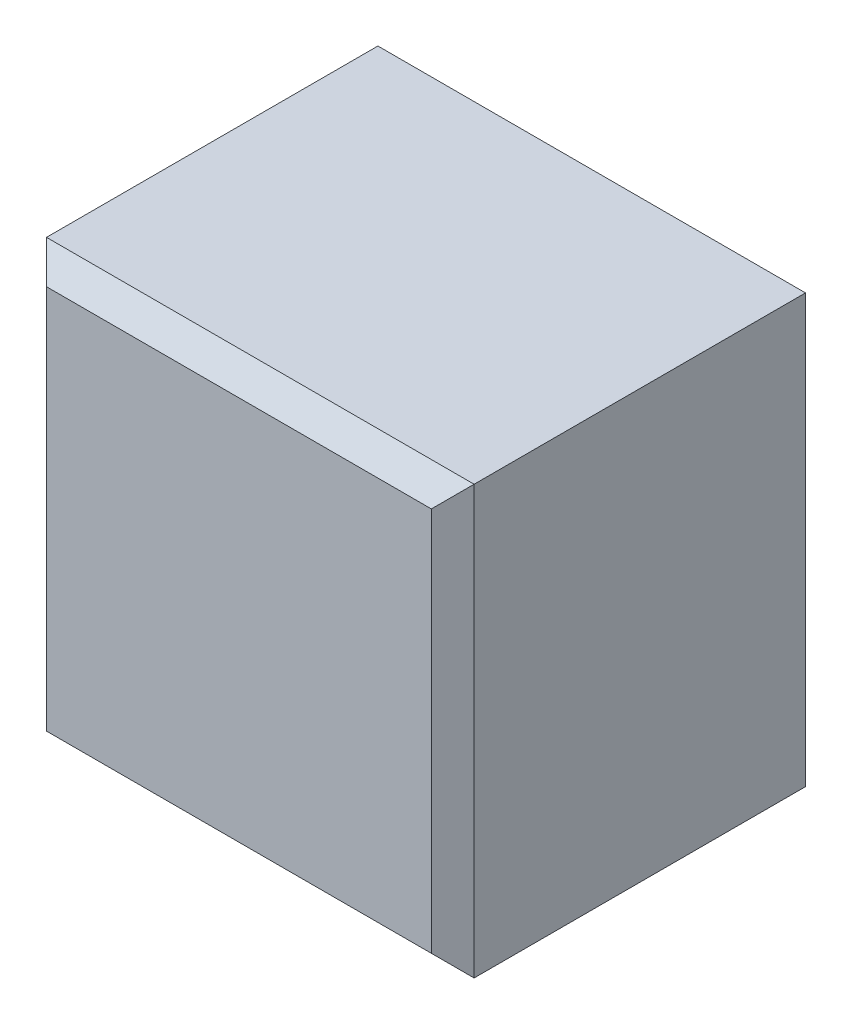
ISO-10303-21;
HEADER;
FILE_DESCRIPTION(('STEP AP214'),'2;1');
FILE_NAME('part.step','',(''),(''),'','','');
FILE_SCHEMA(('AUTOMOTIVE_DESIGN { 1 0 10303 214 1 1 1 1 }'));
ENDSEC;
DATA;
#1=APPLICATION_CONTEXT('core data for automotive mechanical design processes');
#2=APPLICATION_PROTOCOL_DEFINITION('international standard','automotive_design',2000,#1);
#3=PRODUCT_CONTEXT('',#1,'mechanical');
#4=PRODUCT('Part','Part','',(#3));
#5=PRODUCT_RELATED_PRODUCT_CATEGORY('part','',(#4));
#6=PRODUCT_DEFINITION_FORMATION('','',#4);
#7=PRODUCT_DEFINITION_CONTEXT('part definition',#1,'design');
#8=PRODUCT_DEFINITION('design','',#6,#7);
#9=PRODUCT_DEFINITION_SHAPE('','',#8);
#10=(LENGTH_UNIT() NAMED_UNIT(*) SI_UNIT(.MILLI.,.METRE.));
#11=(NAMED_UNIT(*) PLANE_ANGLE_UNIT() SI_UNIT($,.RADIAN.));
#12=(NAMED_UNIT(*) SI_UNIT($,.STERADIAN.) SOLID_ANGLE_UNIT());
#13=UNCERTAINTY_MEASURE_WITH_UNIT(LENGTH_MEASURE(1.E-05),#10,'distance_accuracy_value','');
#14=(GEOMETRIC_REPRESENTATION_CONTEXT(3) GLOBAL_UNCERTAINTY_ASSIGNED_CONTEXT((#13)) GLOBAL_UNIT_ASSIGNED_CONTEXT((#10,
#11,#12)) REPRESENTATION_CONTEXT('',''));
#15=CARTESIAN_POINT('',(0.,0.,0.));
#16=DIRECTION('',(0.,0.,1.));
#17=DIRECTION('',(1.,0.,0.));
#18=AXIS2_PLACEMENT_3D('',#15,#16,#17);
#19=CARTESIAN_POINT('',(-10.,-10.,-8.75));
#20=DIRECTION('',(-1.,0.,0.));
#21=DIRECTION('',(0.,0.,1.));
#22=AXIS2_PLACEMENT_3D('',#19,#20,#21);
#23=PLANE('',#22);
#24=DIRECTION('',(0.,0.,1.));
#25=VECTOR('',#24,1.);
#26=CARTESIAN_POINT('',(-10.,-10.,-8.75));
#27=LINE('',#26,#25);
#28=CARTESIAN_POINT('',(-10.,-10.,-7.75));
#29=VERTEX_POINT('',#28);
#30=CARTESIAN_POINT('',(-10.,-10.,7.74999999999999));
#31=VERTEX_POINT('',#30);
#32=EDGE_CURVE('E184',#29,#31,#27,.T.);
#33=ORIENTED_EDGE('',*,*,#32,.T.);
#34=DIRECTION('',(0.,1.,0.));
#35=VECTOR('',#34,1.);
#36=CARTESIAN_POINT('',(-10.,-10.,7.74999999999999));
#37=LINE('',#36,#35);
#38=CARTESIAN_POINT('',(-10.,10.,7.74999999999999));
#39=VERTEX_POINT('',#38);
#40=EDGE_CURVE('E136',#31,#39,#37,.T.);
#41=ORIENTED_EDGE('',*,*,#40,.T.);
#42=DIRECTION('',(0.,0.,1.));
#43=VECTOR('',#42,1.);
#44=CARTESIAN_POINT('',(-10.,10.,-8.75));
#45=LINE('',#44,#43);
#46=CARTESIAN_POINT('',(-10.,10.,-7.75));
#47=VERTEX_POINT('',#46);
#48=EDGE_CURVE('E155',#47,#39,#45,.T.);
#49=ORIENTED_EDGE('',*,*,#48,.F.);
#50=DIRECTION('',(0.,-1.,0.));
#51=VECTOR('',#50,1.);
#52=CARTESIAN_POINT('',(-10.,-10.,-7.75));
#53=LINE('',#52,#51);
#54=EDGE_CURVE('E134',#47,#29,#53,.T.);
#55=ORIENTED_EDGE('',*,*,#54,.T.);
#56=EDGE_LOOP('',(#33,#41,#49,#55));
#57=FACE_BOUND('',#56,.T.);
#58=ADVANCED_FACE('F35',(#57),#23,.T.);
#59=CARTESIAN_POINT('',(-10.,-10.,-8.75));
#60=DIRECTION('',(0.,0.,-1.));
#61=DIRECTION('',(-1.,0.,0.));
#62=AXIS2_PLACEMENT_3D('',#59,#60,#61);
#63=PLANE('',#62);
#64=DIRECTION('',(0.,-1.,0.));
#65=VECTOR('',#64,1.);
#66=CARTESIAN_POINT('',(9.,-10.,-8.75));
#67=LINE('',#66,#65);
#68=CARTESIAN_POINT('',(9.,9.,-8.75));
#69=VERTEX_POINT('',#68);
#70=CARTESIAN_POINT('',(9.,-9.,-8.75));
#71=VERTEX_POINT('',#70);
#72=EDGE_CURVE('E44',#69,#71,#67,.T.);
#73=ORIENTED_EDGE('',*,*,#72,.T.);
#74=DIRECTION('',(-1.,0.,0.));
#75=VECTOR('',#74,1.);
#76=CARTESIAN_POINT('',(-10.,-9.,-8.75));
#77=LINE('',#76,#75);
#78=CARTESIAN_POINT('',(-9.,-9.,-8.75));
#79=VERTEX_POINT('',#78);
#80=EDGE_CURVE('E11',#71,#79,#77,.T.);
#81=ORIENTED_EDGE('',*,*,#80,.T.);
#82=DIRECTION('',(0.,1.,0.));
#83=VECTOR('',#82,1.);
#84=CARTESIAN_POINT('',(-9.,-10.,-8.75));
#85=LINE('',#84,#83);
#86=CARTESIAN_POINT('',(-9.,9.,-8.75));
#87=VERTEX_POINT('',#86);
#88=EDGE_CURVE('E146',#79,#87,#85,.T.);
#89=ORIENTED_EDGE('',*,*,#88,.T.);
#90=DIRECTION('',(1.,0.,0.));
#91=VECTOR('',#90,1.);
#92=CARTESIAN_POINT('',(-10.,9.,-8.75));
#93=LINE('',#92,#91);
#94=EDGE_CURVE('E55',#87,#69,#93,.T.);
#95=ORIENTED_EDGE('',*,*,#94,.T.);
#96=EDGE_LOOP('',(#73,#81,#89,#95));
#97=FACE_BOUND('',#96,.T.);
#98=ADVANCED_FACE('F201',(#97),#63,.T.);
#99=CARTESIAN_POINT('',(10.,-10.,-8.75));
#100=DIRECTION('',(1.,0.,0.));
#101=DIRECTION('',(0.,0.,-1.));
#102=AXIS2_PLACEMENT_3D('',#99,#100,#101);
#103=PLANE('',#102);
#104=DIRECTION('',(0.,0.,-1.));
#105=VECTOR('',#104,1.);
#106=CARTESIAN_POINT('',(10.,10.,-8.75));
#107=LINE('',#106,#105);
#108=CARTESIAN_POINT('',(10.,10.,7.74999999999999));
#109=VERTEX_POINT('',#108);
#110=CARTESIAN_POINT('',(10.,10.,-7.75));
#111=VERTEX_POINT('',#110);
#112=EDGE_CURVE('E178',#109,#111,#107,.T.);
#113=ORIENTED_EDGE('',*,*,#112,.F.);
#114=DIRECTION('',(0.,-1.,0.));
#115=VECTOR('',#114,1.);
#116=CARTESIAN_POINT('',(10.,-10.,7.74999999999999));
#117=LINE('',#116,#115);
#118=CARTESIAN_POINT('',(10.,-10.,7.74999999999999));
#119=VERTEX_POINT('',#118);
#120=EDGE_CURVE('E144',#109,#119,#117,.T.);
#121=ORIENTED_EDGE('',*,*,#120,.T.);
#122=DIRECTION('',(0.,0.,-1.));
#123=VECTOR('',#122,1.);
#124=CARTESIAN_POINT('',(10.,-10.,-8.75));
#125=LINE('',#124,#123);
#126=CARTESIAN_POINT('',(10.,-10.,-7.75));
#127=VERTEX_POINT('',#126);
#128=EDGE_CURVE('E120',#119,#127,#125,.T.);
#129=ORIENTED_EDGE('',*,*,#128,.T.);
#130=DIRECTION('',(0.,1.,0.));
#131=VECTOR('',#130,1.);
#132=CARTESIAN_POINT('',(10.,-10.,-7.75));
#133=LINE('',#132,#131);
#134=EDGE_CURVE('E142',#127,#111,#133,.T.);
#135=ORIENTED_EDGE('',*,*,#134,.T.);
#136=EDGE_LOOP('',(#113,#121,#129,#135));
#137=FACE_BOUND('',#136,.T.);
#138=ADVANCED_FACE('F199',(#137),#103,.T.);
#139=CARTESIAN_POINT('',(-10.,-10.,8.75));
#140=DIRECTION('',(0.,0.,1.));
#141=DIRECTION('',(1.,0.,0.));
#142=AXIS2_PLACEMENT_3D('',#139,#140,#141);
#143=PLANE('',#142);
#144=DIRECTION('',(0.,-1.,0.));
#145=VECTOR('',#144,1.);
#146=CARTESIAN_POINT('',(-9.,-10.,8.75));
#147=LINE('',#146,#145);
#148=CARTESIAN_POINT('',(-9.,9.,8.75));
#149=VERTEX_POINT('',#148);
#150=CARTESIAN_POINT('',(-9.,-9.,8.75));
#151=VERTEX_POINT('',#150);
#152=EDGE_CURVE('E124',#149,#151,#147,.T.);
#153=ORIENTED_EDGE('',*,*,#152,.T.);
#154=DIRECTION('',(1.,0.,0.));
#155=VECTOR('',#154,1.);
#156=CARTESIAN_POINT('',(10.,-9.,8.75));
#157=LINE('',#156,#155);
#158=CARTESIAN_POINT('',(9.,-9.,8.75));
#159=VERTEX_POINT('',#158);
#160=EDGE_CURVE('E105',#151,#159,#157,.T.);
#161=ORIENTED_EDGE('',*,*,#160,.T.);
#162=DIRECTION('',(0.,1.,0.));
#163=VECTOR('',#162,1.);
#164=CARTESIAN_POINT('',(9.,-10.,8.75));
#165=LINE('',#164,#163);
#166=CARTESIAN_POINT('',(9.,9.,8.75));
#167=VERTEX_POINT('',#166);
#168=EDGE_CURVE('E113',#159,#167,#165,.T.);
#169=ORIENTED_EDGE('',*,*,#168,.T.);
#170=DIRECTION('',(-1.,0.,0.));
#171=VECTOR('',#170,1.);
#172=CARTESIAN_POINT('',(-10.,9.,8.75));
#173=LINE('',#172,#171);
#174=EDGE_CURVE('E119',#167,#149,#173,.T.);
#175=ORIENTED_EDGE('',*,*,#174,.T.);
#176=EDGE_LOOP('',(#153,#161,#169,#175));
#177=FACE_BOUND('',#176,.T.);
#178=ADVANCED_FACE('F122',(#177),#143,.T.);
#179=CARTESIAN_POINT('',(0.,-10.,0.));
#180=DIRECTION('',(0.,1.,0.));
#181=DIRECTION('',(0.,0.,1.));
#182=AXIS2_PLACEMENT_3D('',#179,#180,#181);
#183=PLANE('',#182);
#184=ORIENTED_EDGE('',*,*,#128,.F.);
#185=DIRECTION('',(-1.,0.,0.));
#186=VECTOR('',#185,1.);
#187=CARTESIAN_POINT('',(-10.,-10.,7.74999999999999));
#188=LINE('',#187,#186);
#189=EDGE_CURVE('E107',#119,#31,#188,.T.);
#190=ORIENTED_EDGE('',*,*,#189,.T.);
#191=ORIENTED_EDGE('',*,*,#32,.F.);
#192=DIRECTION('',(1.,0.,0.));
#193=VECTOR('',#192,1.);
#194=CARTESIAN_POINT('',(10.,-10.,-7.75));
#195=LINE('',#194,#193);
#196=EDGE_CURVE('E126',#29,#127,#195,.T.);
#197=ORIENTED_EDGE('',*,*,#196,.T.);
#198=EDGE_LOOP('',(#184,#190,#191,#197));
#199=FACE_BOUND('',#198,.T.);
#200=ADVANCED_FACE('F196',(#199),#183,.F.);
#201=CARTESIAN_POINT('',(0.,10.,0.));
#202=DIRECTION('',(0.,1.,0.));
#203=DIRECTION('',(0.,0.,1.));
#204=AXIS2_PLACEMENT_3D('',#201,#202,#203);
#205=PLANE('',#204);
#206=ORIENTED_EDGE('',*,*,#48,.T.);
#207=DIRECTION('',(1.,0.,0.));
#208=VECTOR('',#207,1.);
#209=CARTESIAN_POINT('',(0.,10.,7.74999999999999));
#210=LINE('',#209,#208);
#211=EDGE_CURVE('E140',#39,#109,#210,.T.);
#212=ORIENTED_EDGE('',*,*,#211,.T.);
#213=ORIENTED_EDGE('',*,*,#112,.T.);
#214=DIRECTION('',(-1.,0.,0.));
#215=VECTOR('',#214,1.);
#216=CARTESIAN_POINT('',(0.,10.,-7.75));
#217=LINE('',#216,#215);
#218=EDGE_CURVE('E138',#111,#47,#217,.T.);
#219=ORIENTED_EDGE('',*,*,#218,.T.);
#220=EDGE_LOOP('',(#206,#212,#213,#219));
#221=FACE_BOUND('',#220,.T.);
#222=ADVANCED_FACE('F175',(#221),#205,.T.);
#223=CARTESIAN_POINT('',(0.,10.,7.74999999999999));
#224=DIRECTION('',(0.,-0.707106781186548,-0.707106781186547));
#225=DIRECTION('',(1.,0.,0.));
#226=AXIS2_PLACEMENT_3D('',#223,#224,#225);
#227=PLANE('',#226);
#228=DIRECTION('',(-0.577350269189625,-0.577350269189625,0.577350269189627));
#229=VECTOR('',#228,1.);
#230=CARTESIAN_POINT('',(2.66666666666668,2.66666666666667,15.0833333333333));
#231=LINE('',#230,#229);
#232=EDGE_CURVE('E116',#109,#167,#231,.T.);
#233=ORIENTED_EDGE('',*,*,#232,.F.);
#234=ORIENTED_EDGE('',*,*,#211,.F.);
#235=DIRECTION('',(0.577350269189625,-0.577350269189626,0.577350269189627));
#236=VECTOR('',#235,1.);
#237=CARTESIAN_POINT('',(-6.66666666666667,6.66666666666667,11.0833333333333));
#238=LINE('',#237,#236);
#239=EDGE_CURVE('E152',#149,#39,#238,.F.);
#240=ORIENTED_EDGE('',*,*,#239,.F.);
#241=ORIENTED_EDGE('',*,*,#174,.F.);
#242=EDGE_LOOP('',(#233,#234,#240,#241));
#243=FACE_BOUND('',#242,.T.);
#244=ADVANCED_FACE('F191',(#243),#227,.F.);
#245=CARTESIAN_POINT('',(-10.,-10.,7.74999999999999));
#246=DIRECTION('',(0.707106781186549,0.,-0.707106781186546));
#247=DIRECTION('',(0.,1.,0.));
#248=AXIS2_PLACEMENT_3D('',#245,#246,#247);
#249=PLANE('',#248);
#250=ORIENTED_EDGE('',*,*,#239,.T.);
#251=ORIENTED_EDGE('',*,*,#40,.F.);
#252=DIRECTION('',(-0.577350269189625,-0.577350269189626,-0.577350269189627));
#253=VECTOR('',#252,1.);
#254=CARTESIAN_POINT('',(-10.,-10.,7.74999999999999));
#255=LINE('',#254,#253);
#256=EDGE_CURVE('E110',#151,#31,#255,.T.);
#257=ORIENTED_EDGE('',*,*,#256,.F.);
#258=ORIENTED_EDGE('',*,*,#152,.F.);
#259=EDGE_LOOP('',(#250,#251,#257,#258));
#260=FACE_BOUND('',#259,.T.);
#261=ADVANCED_FACE('F193',(#260),#249,.F.);
#262=CARTESIAN_POINT('',(9.,-10.,8.75));
#263=DIRECTION('',(-0.707106781186549,0.,-0.707106781186546));
#264=DIRECTION('',(0.,1.,0.));
#265=AXIS2_PLACEMENT_3D('',#262,#263,#264);
#266=PLANE('',#265);
#267=ORIENTED_EDGE('',*,*,#232,.T.);
#268=ORIENTED_EDGE('',*,*,#168,.F.);
#269=DIRECTION('',(-0.577350269189625,0.577350269189625,0.577350269189627));
#270=VECTOR('',#269,1.);
#271=CARTESIAN_POINT('',(9.33333333333334,-9.33333333333333,8.41666666666666));
#272=LINE('',#271,#270);
#273=EDGE_CURVE('E101',#119,#159,#272,.T.);
#274=ORIENTED_EDGE('',*,*,#273,.F.);
#275=ORIENTED_EDGE('',*,*,#120,.F.);
#276=EDGE_LOOP('',(#267,#268,#274,#275));
#277=FACE_BOUND('',#276,.T.);
#278=ADVANCED_FACE('F114',(#277),#266,.F.);
#279=CARTESIAN_POINT('',(-10.,-9.,8.75));
#280=DIRECTION('',(0.,-0.707106781186548,0.707106781186547));
#281=DIRECTION('',(-1.,0.,0.));
#282=AXIS2_PLACEMENT_3D('',#279,#280,#281);
#283=PLANE('',#282);
#284=ORIENTED_EDGE('',*,*,#256,.T.);
#285=ORIENTED_EDGE('',*,*,#189,.F.);
#286=ORIENTED_EDGE('',*,*,#273,.T.);
#287=ORIENTED_EDGE('',*,*,#160,.F.);
#288=EDGE_LOOP('',(#284,#285,#286,#287));
#289=FACE_BOUND('',#288,.T.);
#290=ADVANCED_FACE('F103',(#289),#283,.T.);
#291=CARTESIAN_POINT('',(0.,10.,-7.75));
#292=DIRECTION('',(0.,-0.707106781186547,0.707106781186547));
#293=DIRECTION('',(-1.,0.,0.));
#294=AXIS2_PLACEMENT_3D('',#291,#292,#293);
#295=PLANE('',#294);
#296=DIRECTION('',(0.577350269189626,-0.577350269189626,-0.577350269189626));
#297=VECTOR('',#296,1.);
#298=CARTESIAN_POINT('',(-2.66666666666667,2.66666666666667,-15.0833333333333));
#299=LINE('',#298,#297);
#300=EDGE_CURVE('E159',#47,#87,#299,.T.);
#301=ORIENTED_EDGE('',*,*,#300,.F.);
#302=ORIENTED_EDGE('',*,*,#218,.F.);
#303=DIRECTION('',(-0.577350269189626,-0.577350269189626,-0.577350269189626));
#304=VECTOR('',#303,1.);
#305=CARTESIAN_POINT('',(6.66666666666666,6.66666666666667,-11.0833333333333));
#306=LINE('',#305,#304);
#307=EDGE_CURVE('E39',#69,#111,#306,.F.);
#308=ORIENTED_EDGE('',*,*,#307,.F.);
#309=ORIENTED_EDGE('',*,*,#94,.F.);
#310=EDGE_LOOP('',(#301,#302,#308,#309));
#311=FACE_BOUND('',#310,.T.);
#312=ADVANCED_FACE('F37',(#311),#295,.F.);
#313=CARTESIAN_POINT('',(10.,-10.,-7.75));
#314=DIRECTION('',(-0.707106781186547,0.,0.707106781186548));
#315=DIRECTION('',(0.,1.,0.));
#316=AXIS2_PLACEMENT_3D('',#313,#314,#315);
#317=PLANE('',#316);
#318=ORIENTED_EDGE('',*,*,#307,.T.);
#319=ORIENTED_EDGE('',*,*,#134,.F.);
#320=DIRECTION('',(0.577350269189626,-0.577350269189626,0.577350269189626));
#321=VECTOR('',#320,1.);
#322=CARTESIAN_POINT('',(10.,-10.,-7.75));
#323=LINE('',#322,#321);
#324=EDGE_CURVE('E158',#71,#127,#323,.T.);
#325=ORIENTED_EDGE('',*,*,#324,.F.);
#326=ORIENTED_EDGE('',*,*,#72,.F.);
#327=EDGE_LOOP('',(#318,#319,#325,#326));
#328=FACE_BOUND('',#327,.T.);
#329=ADVANCED_FACE('F168',(#328),#317,.F.);
#330=CARTESIAN_POINT('',(-9.,-10.,-8.75));
#331=DIRECTION('',(0.707106781186547,0.,0.707106781186547));
#332=DIRECTION('',(0.,1.,0.));
#333=AXIS2_PLACEMENT_3D('',#330,#331,#332);
#334=PLANE('',#333);
#335=ORIENTED_EDGE('',*,*,#300,.T.);
#336=ORIENTED_EDGE('',*,*,#88,.F.);
#337=DIRECTION('',(0.577350269189626,0.577350269189626,-0.577350269189626));
#338=VECTOR('',#337,1.);
#339=CARTESIAN_POINT('',(-9.33333333333333,-9.33333333333333,-8.41666666666667));
#340=LINE('',#339,#338);
#341=EDGE_CURVE('E156',#29,#79,#340,.T.);
#342=ORIENTED_EDGE('',*,*,#341,.F.);
#343=ORIENTED_EDGE('',*,*,#54,.F.);
#344=EDGE_LOOP('',(#335,#336,#342,#343));
#345=FACE_BOUND('',#344,.T.);
#346=ADVANCED_FACE('F225',(#345),#334,.F.);
#347=CARTESIAN_POINT('',(-10.,-9.,-8.75));
#348=DIRECTION('',(0.,-0.707106781186547,-0.707106781186547));
#349=DIRECTION('',(1.,0.,0.));
#350=AXIS2_PLACEMENT_3D('',#347,#348,#349);
#351=PLANE('',#350);
#352=ORIENTED_EDGE('',*,*,#324,.T.);
#353=ORIENTED_EDGE('',*,*,#196,.F.);
#354=ORIENTED_EDGE('',*,*,#341,.T.);
#355=ORIENTED_EDGE('',*,*,#80,.F.);
#356=EDGE_LOOP('',(#352,#353,#354,#355));
#357=FACE_BOUND('',#356,.T.);
#358=ADVANCED_FACE('F222',(#357),#351,.T.);
#359=CLOSED_SHELL('',(#58,#98,#138,#178,#200,#222,#244,#261,#278,#290,#312,#329,#346,#358));
#360=MANIFOLD_SOLID_BREP('B2',#359);
#361=ADVANCED_BREP_SHAPE_REPRESENTATION('',(#18,#360),#14);
#362=SHAPE_DEFINITION_REPRESENTATION(#9,#361);
ENDSEC;
END-ISO-10303-21;
